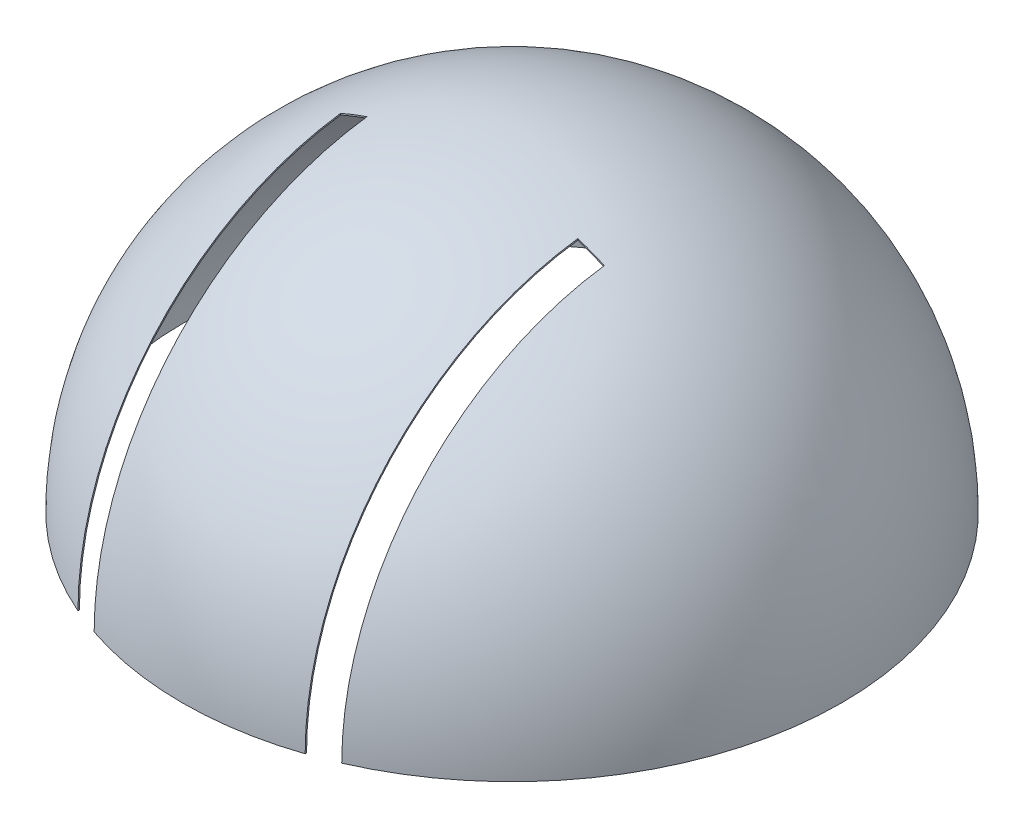
ISO-10303-21;
HEADER;
FILE_DESCRIPTION(('STEP AP214'),'2;1');
FILE_NAME('part.step','',(''),(''),'','','');
FILE_SCHEMA(('AUTOMOTIVE_DESIGN { 1 0 10303 214 1 1 1 1 }'));
ENDSEC;
DATA;
#1=APPLICATION_CONTEXT('core data for automotive mechanical design processes');
#2=APPLICATION_PROTOCOL_DEFINITION('international standard','automotive_design',2000,#1);
#3=PRODUCT_CONTEXT('',#1,'mechanical');
#4=PRODUCT('Part','Part','',(#3));
#5=PRODUCT_RELATED_PRODUCT_CATEGORY('part','',(#4));
#6=PRODUCT_DEFINITION_FORMATION('','',#4);
#7=PRODUCT_DEFINITION_CONTEXT('part definition',#1,'design');
#8=PRODUCT_DEFINITION('design','',#6,#7);
#9=PRODUCT_DEFINITION_SHAPE('','',#8);
#10=(LENGTH_UNIT() NAMED_UNIT(*) SI_UNIT(.MILLI.,.METRE.));
#11=(NAMED_UNIT(*) PLANE_ANGLE_UNIT() SI_UNIT($,.RADIAN.));
#12=(NAMED_UNIT(*) SI_UNIT($,.STERADIAN.) SOLID_ANGLE_UNIT());
#13=UNCERTAINTY_MEASURE_WITH_UNIT(LENGTH_MEASURE(1.E-05),#10,'distance_accuracy_value','');
#14=(GEOMETRIC_REPRESENTATION_CONTEXT(3) GLOBAL_UNCERTAINTY_ASSIGNED_CONTEXT((#13)) GLOBAL_UNIT_ASSIGNED_CONTEXT((#10,
#11,#12)) REPRESENTATION_CONTEXT('',''));
#15=CARTESIAN_POINT('',(0.,0.,0.));
#16=DIRECTION('',(0.,0.,1.));
#17=DIRECTION('',(1.,0.,0.));
#18=AXIS2_PLACEMENT_3D('',#15,#16,#17);
#19=CARTESIAN_POINT('',(0.,0.,0.));
#20=DIRECTION('',(-1.,0.,0.));
#21=DIRECTION('',(0.,0.,1.));
#22=AXIS2_PLACEMENT_3D('',#19,#20,#21);
#23=SPHERICAL_SURFACE('',#22,250.);
#24=CARTESIAN_POINT('',(-80.0000000000001,0.,0.));
#25=DIRECTION('',(-1.,0.,0.));
#26=DIRECTION('',(0.,0.,1.));
#27=AXIS2_PLACEMENT_3D('',#24,#25,#26);
#28=CIRCLE('',#27,236.85438564654);
#29=CARTESIAN_POINT('',(-80.0000000000001,0.,236.85438564654));
#30=VERTEX_POINT('',#29);
#31=CARTESIAN_POINT('',(-80.0000000000001,234.946802489415,30.));
#32=VERTEX_POINT('',#31);
#33=EDGE_CURVE('E102',#30,#32,#28,.T.);
#34=ORIENTED_EDGE('',*,*,#33,.F.);
#35=CARTESIAN_POINT('',(0.,0.,0.));
#36=DIRECTION('',(0.,-1.,0.));
#37=DIRECTION('',(0.,0.,-1.));
#38=AXIS2_PLACEMENT_3D('',#35,#36,#37);
#39=CIRCLE('',#38,250.);
#40=CARTESIAN_POINT('',(80.0000000000001,0.,236.85438564654));
#41=VERTEX_POINT('',#40);
#42=EDGE_CURVE('E113',#41,#30,#39,.T.);
#43=ORIENTED_EDGE('',*,*,#42,.F.);
#44=CARTESIAN_POINT('',(80.0000000000001,0.,0.));
#45=DIRECTION('',(1.,0.,0.));
#46=DIRECTION('',(0.,0.,-1.));
#47=AXIS2_PLACEMENT_3D('',#44,#45,#46);
#48=CIRCLE('',#47,236.85438564654);
#49=CARTESIAN_POINT('',(80.0000000000001,234.946802489415,30.));
#50=VERTEX_POINT('',#49);
#51=EDGE_CURVE('E164',#50,#41,#48,.T.);
#52=ORIENTED_EDGE('',*,*,#51,.F.);
#53=CARTESIAN_POINT('',(0.,0.,30.));
#54=DIRECTION('',(0.,0.,1.));
#55=DIRECTION('',(1.,0.,0.));
#56=AXIS2_PLACEMENT_3D('',#53,#54,#55);
#57=CIRCLE('',#56,248.193472919817);
#58=CARTESIAN_POINT('',(100.,227.156333832011,30.));
#59=VERTEX_POINT('',#58);
#60=EDGE_CURVE('E161',#59,#50,#57,.T.);
#61=ORIENTED_EDGE('',*,*,#60,.F.);
#62=CARTESIAN_POINT('',(100.,0.,0.));
#63=DIRECTION('',(-1.,0.,0.));
#64=DIRECTION('',(0.,0.,1.));
#65=AXIS2_PLACEMENT_3D('',#62,#63,#64);
#66=CIRCLE('',#65,229.128784747792);
#67=CARTESIAN_POINT('',(100.,0.,229.128784747792));
#68=VERTEX_POINT('',#67);
#69=EDGE_CURVE('E163',#68,#59,#66,.T.);
#70=ORIENTED_EDGE('',*,*,#69,.F.);
#71=CARTESIAN_POINT('',(-100.,0.,229.128784747792));
#72=VERTEX_POINT('',#71);
#73=EDGE_CURVE('E121',#72,#68,#39,.T.);
#74=ORIENTED_EDGE('',*,*,#73,.F.);
#75=CARTESIAN_POINT('',(-100.,0.,0.));
#76=DIRECTION('',(1.,0.,0.));
#77=DIRECTION('',(0.,0.,-1.));
#78=AXIS2_PLACEMENT_3D('',#75,#76,#77);
#79=CIRCLE('',#78,229.128784747792);
#80=CARTESIAN_POINT('',(-100.,227.156333832011,30.));
#81=VERTEX_POINT('',#80);
#82=EDGE_CURVE('E146',#81,#72,#79,.T.);
#83=ORIENTED_EDGE('',*,*,#82,.F.);
#84=CARTESIAN_POINT('',(0.,0.,30.));
#85=DIRECTION('',(0.,0.,1.));
#86=DIRECTION('',(1.,0.,0.));
#87=AXIS2_PLACEMENT_3D('',#84,#85,#86);
#88=CIRCLE('',#87,248.193472919817);
#89=EDGE_CURVE('E115',#32,#81,#88,.T.);
#90=ORIENTED_EDGE('',*,*,#89,.F.);
#91=EDGE_LOOP('',(#34,#43,#52,#61,#70,#74,#83,#90));
#92=FACE_BOUND('',#91,.T.);
#93=ADVANCED_FACE('F35',(#92),#23,.T.);
#94=CARTESIAN_POINT('',(0.,0.,0.));
#95=DIRECTION('',(0.,-1.,0.));
#96=DIRECTION('',(0.,0.,-1.));
#97=AXIS2_PLACEMENT_3D('',#94,#95,#96);
#98=PLANE('',#97);
#99=ORIENTED_EDGE('',*,*,#42,.T.);
#100=DIRECTION('',(0.,0.,-1.));
#101=VECTOR('',#100,1.);
#102=CARTESIAN_POINT('',(-80.0000000000001,0.,250.));
#103=LINE('',#102,#101);
#104=CARTESIAN_POINT('',(-80.0000000000001,0.,235.798642913822));
#105=VERTEX_POINT('',#104);
#106=EDGE_CURVE('E98',#30,#105,#103,.T.);
#107=ORIENTED_EDGE('',*,*,#106,.T.);
#108=CARTESIAN_POINT('',(0.,0.,0.));
#109=DIRECTION('',(0.,-1.,0.));
#110=DIRECTION('',(0.,0.,-1.));
#111=AXIS2_PLACEMENT_3D('',#108,#109,#110);
#112=CIRCLE('',#111,249.);
#113=CARTESIAN_POINT('',(80.0000000000001,0.,235.798642913822));
#114=VERTEX_POINT('',#113);
#115=EDGE_CURVE('E126',#114,#105,#112,.T.);
#116=ORIENTED_EDGE('',*,*,#115,.F.);
#117=DIRECTION('',(0.,0.,1.));
#118=VECTOR('',#117,1.);
#119=CARTESIAN_POINT('',(80.0000000000001,0.,250.));
#120=LINE('',#119,#118);
#121=EDGE_CURVE('E116',#114,#41,#120,.T.);
#122=ORIENTED_EDGE('',*,*,#121,.T.);
#123=EDGE_LOOP('',(#99,#107,#116,#122));
#124=FACE_BOUND('',#123,.T.);
#125=ADVANCED_FACE('F119',(#124),#98,.T.);
#126=CARTESIAN_POINT('',(-100.,-1.5923757989814E-12,228.037277654334));
#127=VERTEX_POINT('',#126);
#128=CARTESIAN_POINT('',(100.,0.,228.037277654334));
#129=VERTEX_POINT('',#128);
#130=EDGE_CURVE('E165',#127,#129,#112,.T.);
#131=ORIENTED_EDGE('',*,*,#130,.F.);
#132=DIRECTION('',(0.,0.,1.));
#133=VECTOR('',#132,1.);
#134=CARTESIAN_POINT('',(-100.,0.,250.));
#135=LINE('',#134,#133);
#136=EDGE_CURVE('E49',#127,#72,#135,.T.);
#137=ORIENTED_EDGE('',*,*,#136,.T.);
#138=ORIENTED_EDGE('',*,*,#73,.T.);
#139=DIRECTION('',(0.,0.,-1.));
#140=VECTOR('',#139,1.);
#141=CARTESIAN_POINT('',(100.,0.,250.));
#142=LINE('',#141,#140);
#143=EDGE_CURVE('E154',#68,#129,#142,.T.);
#144=ORIENTED_EDGE('',*,*,#143,.T.);
#145=EDGE_LOOP('',(#131,#137,#138,#144));
#146=FACE_BOUND('',#145,.T.);
#147=ADVANCED_FACE('F178',(#146),#98,.T.);
#148=CARTESIAN_POINT('',(0.,0.,0.));
#149=DIRECTION('',(-1.,0.,0.));
#150=DIRECTION('',(0.,0.,1.));
#151=AXIS2_PLACEMENT_3D('',#148,#149,#150);
#152=SPHERICAL_SURFACE('',#151,249.);
#153=ORIENTED_EDGE('',*,*,#115,.T.);
#154=CARTESIAN_POINT('',(-80.0000000000001,0.,0.));
#155=DIRECTION('',(-1.,0.,0.));
#156=DIRECTION('',(0.,0.,1.));
#157=AXIS2_PLACEMENT_3D('',#154,#155,#156);
#158=CIRCLE('',#157,235.798642913822);
#159=CARTESIAN_POINT('',(-80.0000000000001,233.882449106383,30.));
#160=VERTEX_POINT('',#159);
#161=EDGE_CURVE('E11',#105,#160,#158,.T.);
#162=ORIENTED_EDGE('',*,*,#161,.T.);
#163=CARTESIAN_POINT('',(0.,0.,30.));
#164=DIRECTION('',(0.,0.,1.));
#165=DIRECTION('',(1.,0.,0.));
#166=AXIS2_PLACEMENT_3D('',#163,#164,#165);
#167=CIRCLE('',#166,247.186164661374);
#168=CARTESIAN_POINT('',(-100.,226.055302968101,30.));
#169=VERTEX_POINT('',#168);
#170=EDGE_CURVE('E42',#160,#169,#167,.T.);
#171=ORIENTED_EDGE('',*,*,#170,.T.);
#172=CARTESIAN_POINT('',(-100.,0.,0.));
#173=DIRECTION('',(1.,0.,0.));
#174=DIRECTION('',(0.,0.,-1.));
#175=AXIS2_PLACEMENT_3D('',#172,#173,#174);
#176=CIRCLE('',#175,228.037277654334);
#177=EDGE_CURVE('E135',#169,#127,#176,.T.);
#178=ORIENTED_EDGE('',*,*,#177,.T.);
#179=ORIENTED_EDGE('',*,*,#130,.T.);
#180=CARTESIAN_POINT('',(100.,0.,0.));
#181=DIRECTION('',(-1.,0.,0.));
#182=DIRECTION('',(0.,0.,1.));
#183=AXIS2_PLACEMENT_3D('',#180,#181,#182);
#184=CIRCLE('',#183,228.037277654334);
#185=CARTESIAN_POINT('',(100.,226.055302968101,30.));
#186=VERTEX_POINT('',#185);
#187=EDGE_CURVE('E124',#129,#186,#184,.T.);
#188=ORIENTED_EDGE('',*,*,#187,.T.);
#189=CARTESIAN_POINT('',(0.,0.,30.));
#190=DIRECTION('',(0.,0.,1.));
#191=DIRECTION('',(1.,0.,0.));
#192=AXIS2_PLACEMENT_3D('',#189,#190,#191);
#193=CIRCLE('',#192,247.186164661374);
#194=CARTESIAN_POINT('',(80.0000000000001,233.882449106383,30.));
#195=VERTEX_POINT('',#194);
#196=EDGE_CURVE('E120',#186,#195,#193,.T.);
#197=ORIENTED_EDGE('',*,*,#196,.T.);
#198=CARTESIAN_POINT('',(80.0000000000001,0.,0.));
#199=DIRECTION('',(1.,0.,0.));
#200=DIRECTION('',(0.,0.,-1.));
#201=AXIS2_PLACEMENT_3D('',#198,#199,#200);
#202=CIRCLE('',#201,235.798642913822);
#203=EDGE_CURVE('E132',#195,#114,#202,.T.);
#204=ORIENTED_EDGE('',*,*,#203,.T.);
#205=EDGE_LOOP('',(#153,#162,#171,#178,#179,#188,#197,#204));
#206=FACE_BOUND('',#205,.T.);
#207=ADVANCED_FACE('F138',(#206),#152,.F.);
#208=CARTESIAN_POINT('',(80.0000000000001,250.,250.));
#209=DIRECTION('',(1.,0.,0.));
#210=DIRECTION('',(0.,0.,-1.));
#211=AXIS2_PLACEMENT_3D('',#208,#209,#210);
#212=PLANE('',#211);
#213=ORIENTED_EDGE('',*,*,#51,.T.);
#214=ORIENTED_EDGE('',*,*,#121,.F.);
#215=ORIENTED_EDGE('',*,*,#203,.F.);
#216=DIRECTION('',(0.,-1.,0.));
#217=VECTOR('',#216,1.);
#218=CARTESIAN_POINT('',(80.0000000000001,250.,30.));
#219=LINE('',#218,#217);
#220=EDGE_CURVE('E57',#50,#195,#219,.T.);
#221=ORIENTED_EDGE('',*,*,#220,.F.);
#222=EDGE_LOOP('',(#213,#214,#215,#221));
#223=FACE_BOUND('',#222,.T.);
#224=ADVANCED_FACE('F168',(#223),#212,.T.);
#225=CARTESIAN_POINT('',(100.,250.,250.));
#226=DIRECTION('',(-1.,0.,0.));
#227=DIRECTION('',(0.,0.,1.));
#228=AXIS2_PLACEMENT_3D('',#225,#226,#227);
#229=PLANE('',#228);
#230=ORIENTED_EDGE('',*,*,#69,.T.);
#231=DIRECTION('',(0.,-1.,0.));
#232=VECTOR('',#231,1.);
#233=CARTESIAN_POINT('',(100.,250.,30.));
#234=LINE('',#233,#232);
#235=EDGE_CURVE('E158',#59,#186,#234,.T.);
#236=ORIENTED_EDGE('',*,*,#235,.T.);
#237=ORIENTED_EDGE('',*,*,#187,.F.);
#238=ORIENTED_EDGE('',*,*,#143,.F.);
#239=EDGE_LOOP('',(#230,#236,#237,#238));
#240=FACE_BOUND('',#239,.T.);
#241=ADVANCED_FACE('F175',(#240),#229,.T.);
#242=CARTESIAN_POINT('',(80.0000000000001,250.,30.));
#243=DIRECTION('',(0.,0.,1.));
#244=DIRECTION('',(1.,0.,0.));
#245=AXIS2_PLACEMENT_3D('',#242,#243,#244);
#246=PLANE('',#245);
#247=ORIENTED_EDGE('',*,*,#60,.T.);
#248=ORIENTED_EDGE('',*,*,#220,.T.);
#249=ORIENTED_EDGE('',*,*,#196,.F.);
#250=ORIENTED_EDGE('',*,*,#235,.F.);
#251=EDGE_LOOP('',(#247,#248,#249,#250));
#252=FACE_BOUND('',#251,.T.);
#253=ADVANCED_FACE('F173',(#252),#246,.T.);
#254=CARTESIAN_POINT('',(-80.0000000000001,250.,250.));
#255=DIRECTION('',(-1.,0.,0.));
#256=DIRECTION('',(0.,0.,1.));
#257=AXIS2_PLACEMENT_3D('',#254,#255,#256);
#258=PLANE('',#257);
#259=ORIENTED_EDGE('',*,*,#33,.T.);
#260=DIRECTION('',(0.,-1.,0.));
#261=VECTOR('',#260,1.);
#262=CARTESIAN_POINT('',(-80.0000000000001,250.,30.));
#263=LINE('',#262,#261);
#264=EDGE_CURVE('E143',#32,#160,#263,.T.);
#265=ORIENTED_EDGE('',*,*,#264,.T.);
#266=ORIENTED_EDGE('',*,*,#161,.F.);
#267=ORIENTED_EDGE('',*,*,#106,.F.);
#268=EDGE_LOOP('',(#259,#265,#266,#267));
#269=FACE_BOUND('',#268,.T.);
#270=ADVANCED_FACE('F100',(#269),#258,.T.);
#271=CARTESIAN_POINT('',(-80.0000000000001,250.,30.));
#272=DIRECTION('',(0.,0.,1.));
#273=DIRECTION('',(1.,0.,0.));
#274=AXIS2_PLACEMENT_3D('',#271,#272,#273);
#275=PLANE('',#274);
#276=ORIENTED_EDGE('',*,*,#89,.T.);
#277=DIRECTION('',(0.,-1.,0.));
#278=VECTOR('',#277,1.);
#279=CARTESIAN_POINT('',(-100.,250.,30.));
#280=LINE('',#279,#278);
#281=EDGE_CURVE('E145',#81,#169,#280,.T.);
#282=ORIENTED_EDGE('',*,*,#281,.T.);
#283=ORIENTED_EDGE('',*,*,#170,.F.);
#284=ORIENTED_EDGE('',*,*,#264,.F.);
#285=EDGE_LOOP('',(#276,#282,#283,#284));
#286=FACE_BOUND('',#285,.T.);
#287=ADVANCED_FACE('F142',(#286),#275,.T.);
#288=CARTESIAN_POINT('',(-100.,250.,250.));
#289=DIRECTION('',(1.,0.,0.));
#290=DIRECTION('',(0.,0.,-1.));
#291=AXIS2_PLACEMENT_3D('',#288,#289,#290);
#292=PLANE('',#291);
#293=ORIENTED_EDGE('',*,*,#82,.T.);
#294=ORIENTED_EDGE('',*,*,#136,.F.);
#295=ORIENTED_EDGE('',*,*,#177,.F.);
#296=ORIENTED_EDGE('',*,*,#281,.F.);
#297=EDGE_LOOP('',(#293,#294,#295,#296));
#298=FACE_BOUND('',#297,.T.);
#299=ADVANCED_FACE('F179',(#298),#292,.T.);
#300=CLOSED_SHELL('',(#93,#125,#147,#207,#224,#241,#253,#270,#287,#299));
#301=MANIFOLD_SOLID_BREP('B2',#300);
#302=ADVANCED_BREP_SHAPE_REPRESENTATION('',(#18,#301),#14);
#303=SHAPE_DEFINITION_REPRESENTATION(#9,#302);
ENDSEC;
END-ISO-10303-21;
